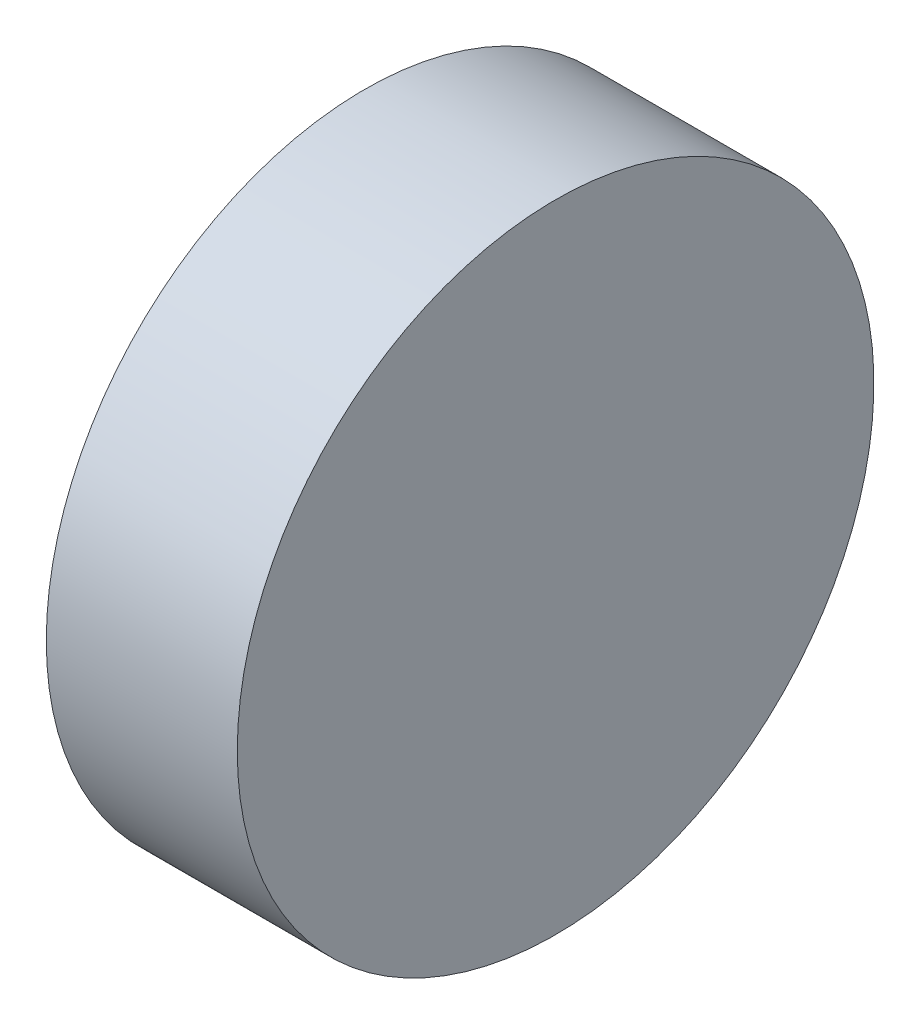
ISO-10303-21;
HEADER;
FILE_DESCRIPTION(('STEP AP214'),'2;1');
FILE_NAME('part.step','',(''),(''),'','','');
FILE_SCHEMA(('AUTOMOTIVE_DESIGN { 1 0 10303 214 1 1 1 1 }'));
ENDSEC;
DATA;
#1=APPLICATION_CONTEXT('core data for automotive mechanical design processes');
#2=APPLICATION_PROTOCOL_DEFINITION('international standard','automotive_design',2000,#1);
#3=PRODUCT_CONTEXT('',#1,'mechanical');
#4=PRODUCT('Part','Part','',(#3));
#5=PRODUCT_RELATED_PRODUCT_CATEGORY('part','',(#4));
#6=PRODUCT_DEFINITION_FORMATION('','',#4);
#7=PRODUCT_DEFINITION_CONTEXT('part definition',#1,'design');
#8=PRODUCT_DEFINITION('design','',#6,#7);
#9=PRODUCT_DEFINITION_SHAPE('','',#8);
#10=(LENGTH_UNIT() NAMED_UNIT(*) SI_UNIT(.MILLI.,.METRE.));
#11=(NAMED_UNIT(*) PLANE_ANGLE_UNIT() SI_UNIT($,.RADIAN.));
#12=(NAMED_UNIT(*) SI_UNIT($,.STERADIAN.) SOLID_ANGLE_UNIT());
#13=UNCERTAINTY_MEASURE_WITH_UNIT(LENGTH_MEASURE(1.E-05),#10,'distance_accuracy_value','');
#14=(GEOMETRIC_REPRESENTATION_CONTEXT(3) GLOBAL_UNCERTAINTY_ASSIGNED_CONTEXT((#13)) GLOBAL_UNIT_ASSIGNED_CONTEXT((#10,
#11,#12)) REPRESENTATION_CONTEXT('',''));
#15=CARTESIAN_POINT('',(0.,0.,0.));
#16=DIRECTION('',(0.,0.,1.));
#17=DIRECTION('',(1.,0.,0.));
#18=AXIS2_PLACEMENT_3D('',#15,#16,#17);
#19=CARTESIAN_POINT('',(15.24,0.,0.));
#20=DIRECTION('',(-1.,0.,0.));
#21=DIRECTION('',(0.,0.,1.));
#22=AXIS2_PLACEMENT_3D('',#19,#20,#21);
#23=CYLINDRICAL_SURFACE('',#22,25.4);
#24=CARTESIAN_POINT('',(15.24,0.,0.));
#25=DIRECTION('',(1.,0.,0.));
#26=DIRECTION('',(0.,0.,-1.));
#27=AXIS2_PLACEMENT_3D('',#24,#25,#26);
#28=CIRCLE('',#27,25.4);
#29=CARTESIAN_POINT('',(15.24,0.,25.4));
#30=VERTEX_POINT('',#29);
#31=EDGE_CURVE('E10',#30,#30,#28,.T.);
#32=CARTESIAN_POINT('',(0.,0.,0.));
#33=DIRECTION('',(1.,0.,0.));
#34=DIRECTION('',(0.,0.,-1.));
#35=AXIS2_PLACEMENT_3D('',#32,#33,#34);
#36=CIRCLE('',#35,25.4);
#37=CARTESIAN_POINT('',(0.,0.,25.4));
#38=VERTEX_POINT('',#37);
#39=EDGE_CURVE('E36',#38,#38,#36,.T.);
#40=CARTESIAN_POINT('',(15.24,0.,25.4));
#41=CARTESIAN_POINT('',(15.08125,0.,25.4));
#42=CARTESIAN_POINT('',(14.9225,0.,25.4));
#43=CARTESIAN_POINT('',(14.605,0.,25.4));
#44=CARTESIAN_POINT('',(14.44625,0.,25.4));
#45=CARTESIAN_POINT('',(14.12875,0.,25.4));
#46=CARTESIAN_POINT('',(13.97,0.,25.4));
#47=CARTESIAN_POINT('',(13.6525,0.,25.4));
#48=CARTESIAN_POINT('',(13.49375,0.,25.4));
#49=CARTESIAN_POINT('',(13.17625,0.,25.4));
#50=CARTESIAN_POINT('',(13.0175,0.,25.4));
#51=CARTESIAN_POINT('',(12.7,0.,25.4));
#52=CARTESIAN_POINT('',(12.54125,0.,25.4));
#53=CARTESIAN_POINT('',(12.22375,0.,25.4));
#54=CARTESIAN_POINT('',(12.065,0.,25.4));
#55=CARTESIAN_POINT('',(11.7475,0.,25.4));
#56=CARTESIAN_POINT('',(11.58875,0.,25.4));
#57=CARTESIAN_POINT('',(11.27125,0.,25.4));
#58=CARTESIAN_POINT('',(11.1125,0.,25.4));
#59=CARTESIAN_POINT('',(10.795,0.,25.4));
#60=CARTESIAN_POINT('',(10.63625,0.,25.4));
#61=CARTESIAN_POINT('',(10.31875,0.,25.4));
#62=CARTESIAN_POINT('',(10.16,0.,25.4));
#63=CARTESIAN_POINT('',(9.8425,0.,25.4));
#64=CARTESIAN_POINT('',(9.68375,0.,25.4));
#65=CARTESIAN_POINT('',(9.36625,0.,25.4));
#66=CARTESIAN_POINT('',(9.2075,0.,25.4));
#67=CARTESIAN_POINT('',(8.89,0.,25.4));
#68=CARTESIAN_POINT('',(8.73125,0.,25.4));
#69=CARTESIAN_POINT('',(8.41375,0.,25.4));
#70=CARTESIAN_POINT('',(8.255,0.,25.4));
#71=CARTESIAN_POINT('',(7.9375,0.,25.4));
#72=CARTESIAN_POINT('',(7.77875,0.,25.4));
#73=CARTESIAN_POINT('',(7.46125,0.,25.4));
#74=CARTESIAN_POINT('',(7.3025,0.,25.4));
#75=CARTESIAN_POINT('',(6.985,0.,25.4));
#76=CARTESIAN_POINT('',(6.82625,0.,25.4));
#77=CARTESIAN_POINT('',(6.50875,0.,25.4));
#78=CARTESIAN_POINT('',(6.35,0.,25.4));
#79=CARTESIAN_POINT('',(6.0325,0.,25.4));
#80=CARTESIAN_POINT('',(5.87375,0.,25.4));
#81=CARTESIAN_POINT('',(5.55625,0.,25.4));
#82=CARTESIAN_POINT('',(5.3975,0.,25.4));
#83=CARTESIAN_POINT('',(5.08,0.,25.4));
#84=CARTESIAN_POINT('',(4.92125,0.,25.4));
#85=CARTESIAN_POINT('',(4.60375,0.,25.4));
#86=CARTESIAN_POINT('',(4.445,0.,25.4));
#87=CARTESIAN_POINT('',(4.1275,0.,25.4));
#88=CARTESIAN_POINT('',(3.96875,0.,25.4));
#89=CARTESIAN_POINT('',(3.65125,0.,25.4));
#90=CARTESIAN_POINT('',(3.4925,0.,25.4));
#91=CARTESIAN_POINT('',(3.175,0.,25.4));
#92=CARTESIAN_POINT('',(3.01625,0.,25.4));
#93=CARTESIAN_POINT('',(2.69875,0.,25.4));
#94=CARTESIAN_POINT('',(2.54,0.,25.4));
#95=CARTESIAN_POINT('',(2.2225,0.,25.4));
#96=CARTESIAN_POINT('',(2.06375,0.,25.4));
#97=CARTESIAN_POINT('',(1.74625,0.,25.4));
#98=CARTESIAN_POINT('',(1.5875,0.,25.4));
#99=CARTESIAN_POINT('',(1.27,0.,25.4));
#100=CARTESIAN_POINT('',(1.11125,0.,25.4));
#101=CARTESIAN_POINT('',(0.79375,0.,25.4));
#102=CARTESIAN_POINT('',(0.634999999999999,0.,25.4));
#103=CARTESIAN_POINT('',(0.3175,0.,25.4));
#104=CARTESIAN_POINT('',(0.15875,0.,25.4));
#105=CARTESIAN_POINT('',(0.,0.,25.4));
#106=B_SPLINE_CURVE_WITH_KNOTS('',3,(#40,#41,#42,#43,#44,#45,#46,#47,#48,#49,#50,#51,#52,#53,
#54,#55,#56,#57,#58,#59,#60,#61,#62,#63,#64,#65,#66,#67,#68,#69,#70,#71,#72,#73,#74,#75,#76,#77,
#78,#79,#80,#81,#82,#83,#84,#85,#86,#87,#88,#89,#90,#91,#92,#93,#94,#95,#96,#97,#98,#99,#100,
#101,#102,#103,#104,#105),.UNSPECIFIED.,.F.,.F.,(4,2,2,2,2,2,2,2,2,2,2,2,2,2,2,2,2,2,2,2,2,2,2,
2,2,2,2,2,2,2,2,2,4),(0.,0.476250000000001,0.9525,1.42875,1.905,2.38125,2.8575,3.33375,3.81,
4.28625,4.7625,5.23875,5.715,6.19125,6.6675,7.14375,7.62,8.09625,8.5725,9.04875,9.525,10.00125,
10.4775,10.95375,11.43,11.90625,12.3825,12.85875,13.335,13.81125,14.2875,14.76375,15.24),.UNSPECIFIED.);
#107=EDGE_CURVE('BSEAM33',#30,#38,#106,.T.);
#108=ORIENTED_EDGE('',*,*,#31,.F.);
#109=ORIENTED_EDGE('',*,*,#39,.T.);
#110=ORIENTED_EDGE('',*,*,#107,.T.);
#111=ORIENTED_EDGE('',*,*,#107,.F.);
#112=EDGE_LOOP('',(#108,#110,#109,#111));
#113=FACE_BOUND('',#112,.T.);
#114=ADVANCED_FACE('F33',(#113),#23,.T.);
#115=CARTESIAN_POINT('',(15.24,0.,0.));
#116=DIRECTION('',(1.,0.,0.));
#117=DIRECTION('',(0.,0.,-1.));
#118=AXIS2_PLACEMENT_3D('',#115,#116,#117);
#119=PLANE('',#118);
#120=ORIENTED_EDGE('',*,*,#31,.T.);
#121=EDGE_LOOP('',(#120));
#122=FACE_BOUND('',#121,.T.);
#123=ADVANCED_FACE('F48',(#122),#119,.T.);
#124=CARTESIAN_POINT('',(0.,0.,0.));
#125=DIRECTION('',(1.,0.,0.));
#126=DIRECTION('',(0.,0.,-1.));
#127=AXIS2_PLACEMENT_3D('',#124,#125,#126);
#128=PLANE('',#127);
#129=ORIENTED_EDGE('',*,*,#39,.F.);
#130=EDGE_LOOP('',(#129));
#131=FACE_BOUND('',#130,.T.);
#132=ADVANCED_FACE('F46',(#131),#128,.F.);
#133=CLOSED_SHELL('',(#114,#123,#132));
#134=MANIFOLD_SOLID_BREP('B2',#133);
#135=ADVANCED_BREP_SHAPE_REPRESENTATION('',(#18,#134),#14);
#136=SHAPE_DEFINITION_REPRESENTATION(#9,#135);
ENDSEC;
END-ISO-10303-21;
